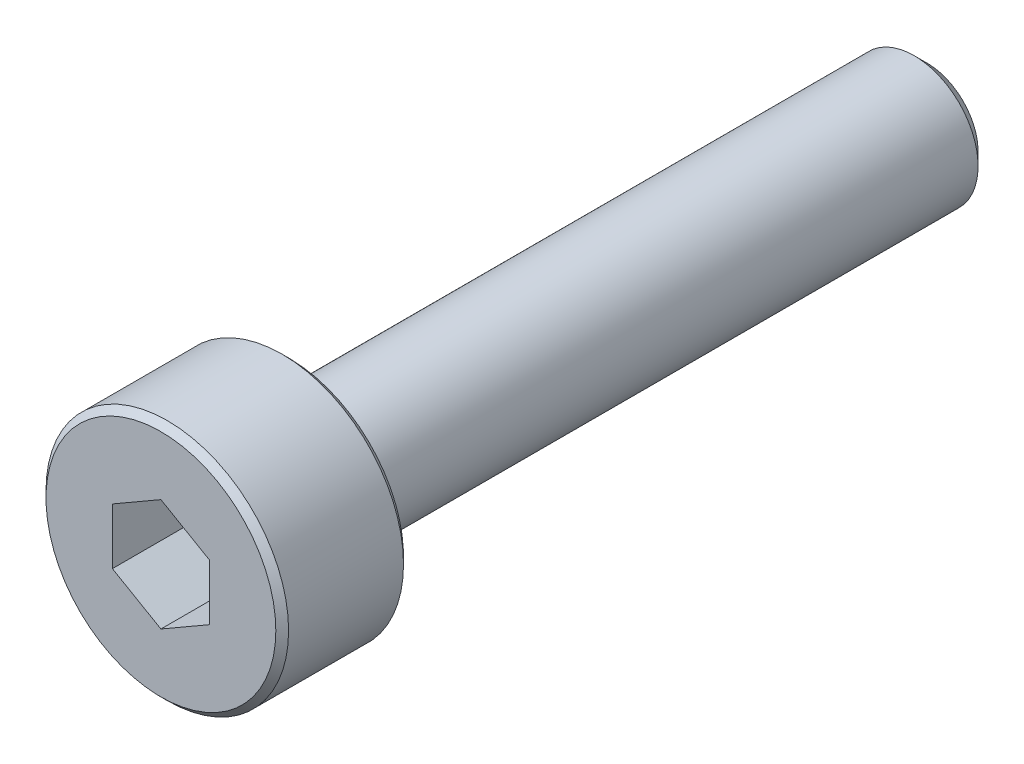
ISO-10303-21;
HEADER;
FILE_DESCRIPTION(('STEP AP214'),'2;1');
FILE_NAME('part.step','',(''),(''),'','','');
FILE_SCHEMA(('AUTOMOTIVE_DESIGN { 1 0 10303 214 1 1 1 1 }'));
ENDSEC;
DATA;
#1=APPLICATION_CONTEXT('core data for automotive mechanical design processes');
#2=APPLICATION_PROTOCOL_DEFINITION('international standard','automotive_design',2000,#1);
#3=PRODUCT_CONTEXT('',#1,'mechanical');
#4=PRODUCT('Part','Part','',(#3));
#5=PRODUCT_RELATED_PRODUCT_CATEGORY('part','',(#4));
#6=PRODUCT_DEFINITION_FORMATION('','',#4);
#7=PRODUCT_DEFINITION_CONTEXT('part definition',#1,'design');
#8=PRODUCT_DEFINITION('design','',#6,#7);
#9=PRODUCT_DEFINITION_SHAPE('','',#8);
#10=(LENGTH_UNIT() NAMED_UNIT(*) SI_UNIT(.MILLI.,.METRE.));
#11=(NAMED_UNIT(*) PLANE_ANGLE_UNIT() SI_UNIT($,.RADIAN.));
#12=(NAMED_UNIT(*) SI_UNIT($,.STERADIAN.) SOLID_ANGLE_UNIT());
#13=UNCERTAINTY_MEASURE_WITH_UNIT(LENGTH_MEASURE(1.E-05),#10,'distance_accuracy_value','');
#14=(GEOMETRIC_REPRESENTATION_CONTEXT(3) GLOBAL_UNCERTAINTY_ASSIGNED_CONTEXT((#13)) GLOBAL_UNIT_ASSIGNED_CONTEXT((#10,
#11,#12)) REPRESENTATION_CONTEXT('',''));
#15=CARTESIAN_POINT('',(0.,0.,0.));
#16=DIRECTION('',(0.,0.,1.));
#17=DIRECTION('',(1.,0.,0.));
#18=AXIS2_PLACEMENT_3D('',#15,#16,#17);
#19=CARTESIAN_POINT('',(0.,0.,10.));
#20=DIRECTION('',(0.,0.,1.));
#21=DIRECTION('',(1.,0.,0.));
#22=AXIS2_PLACEMENT_3D('',#19,#20,#21);
#23=CYLINDRICAL_SURFACE('',#22,1.9);
#24=CARTESIAN_POINT('',(0.,0.,10.1000007633703));
#25=DIRECTION('',(0.,0.,-1.));
#26=DIRECTION('',(-1.,0.,0.));
#27=AXIS2_PLACEMENT_3D('',#24,#25,#26);
#28=CIRCLE('',#27,1.9);
#29=CARTESIAN_POINT('',(-1.9,0.,10.1000007633703));
#30=VERTEX_POINT('',#29);
#31=EDGE_CURVE('E153',#30,#30,#28,.F.);
#32=ORIENTED_EDGE('',*,*,#31,.T.);
#33=EDGE_LOOP('',(#32));
#34=FACE_BOUND('',#33,.T.);
#35=CARTESIAN_POINT('',(0.,0.,11.8999991776262));
#36=DIRECTION('',(0.,0.,1.));
#37=DIRECTION('',(1.,0.,0.));
#38=AXIS2_PLACEMENT_3D('',#35,#36,#37);
#39=CIRCLE('',#38,1.9);
#40=CARTESIAN_POINT('',(1.9,0.,11.8999991776262));
#41=VERTEX_POINT('',#40);
#42=EDGE_CURVE('E150',#41,#41,#39,.F.);
#43=ORIENTED_EDGE('',*,*,#42,.T.);
#44=EDGE_LOOP('',(#43));
#45=FACE_BOUND('',#44,.T.);
#46=ADVANCED_FACE('F39',(#34,#45),#23,.T.);
#47=CARTESIAN_POINT('',(1.9,0.,10.));
#48=DIRECTION('',(0.,0.,-1.));
#49=DIRECTION('',(-1.,0.,0.));
#50=AXIS2_PLACEMENT_3D('',#47,#48,#49);
#51=PLANE('',#50);
#52=CARTESIAN_POINT('',(0.,0.,10.));
#53=DIRECTION('',(0.,0.,-1.));
#54=DIRECTION('',(-1.,0.,0.));
#55=AXIS2_PLACEMENT_3D('',#52,#53,#54);
#56=CIRCLE('',#55,1.79999917762621);
#57=CARTESIAN_POINT('',(-1.79999917762621,0.,10.));
#58=VERTEX_POINT('',#57);
#59=EDGE_CURVE('E156',#58,#58,#56,.T.);
#60=ORIENTED_EDGE('',*,*,#59,.T.);
#61=EDGE_LOOP('',(#60));
#62=FACE_BOUND('',#61,.T.);
#63=CARTESIAN_POINT('',(0.,0.,10.));
#64=DIRECTION('',(0.,0.,-1.));
#65=DIRECTION('',(-1.,0.,0.));
#66=AXIS2_PLACEMENT_3D('',#63,#64,#65);
#67=CIRCLE('',#66,1.);
#68=CARTESIAN_POINT('',(-1.,0.,10.));
#69=VERTEX_POINT('',#68);
#70=EDGE_CURVE('E142',#69,#69,#67,.T.);
#71=ORIENTED_EDGE('',*,*,#70,.F.);
#72=EDGE_LOOP('',(#71));
#73=FACE_BOUND('',#72,.T.);
#74=ADVANCED_FACE('F176',(#62,#73),#51,.T.);
#75=CARTESIAN_POINT('',(0.,0.,12.));
#76=DIRECTION('',(0.,0.,1.));
#77=DIRECTION('',(1.,0.,0.));
#78=AXIS2_PLACEMENT_3D('',#75,#76,#77);
#79=PLANE('',#78);
#80=CARTESIAN_POINT('',(0.,0.,12.));
#81=DIRECTION('',(0.,0.,1.));
#82=DIRECTION('',(1.,0.,0.));
#83=AXIS2_PLACEMENT_3D('',#80,#81,#82);
#84=CIRCLE('',#83,1.79999923662968);
#85=CARTESIAN_POINT('',(1.79999923662968,0.,12.));
#86=VERTEX_POINT('',#85);
#87=EDGE_CURVE('E159',#86,#86,#84,.T.);
#88=ORIENTED_EDGE('',*,*,#87,.T.);
#89=EDGE_LOOP('',(#88));
#90=FACE_BOUND('',#89,.T.);
#91=DIRECTION('',(0.,-1.,0.));
#92=VECTOR('',#91,1.);
#93=CARTESIAN_POINT('',(-0.759999999999996,0.438786204584093,12.));
#94=LINE('',#93,#92);
#95=CARTESIAN_POINT('',(-0.759999999999996,0.438786204584093,12.));
#96=VERTEX_POINT('',#95);
#97=CARTESIAN_POINT('',(-0.76,-0.4387862045841,12.));
#98=VERTEX_POINT('',#97);
#99=EDGE_CURVE('E55',#96,#98,#94,.T.);
#100=ORIENTED_EDGE('',*,*,#99,.F.);
#101=DIRECTION('',(-0.866025403784438,-0.500000000000002,0.));
#102=VECTOR('',#101,1.);
#103=CARTESIAN_POINT('',(0.,0.877572409168213,12.));
#104=LINE('',#103,#102);
#105=CARTESIAN_POINT('',(0.,0.877572409168213,12.));
#106=VERTEX_POINT('',#105);
#107=EDGE_CURVE('E138',#106,#96,#104,.T.);
#108=ORIENTED_EDGE('',*,*,#107,.F.);
#109=DIRECTION('',(-0.866025403784438,0.500000000000002,0.));
#110=VECTOR('',#109,1.);
#111=CARTESIAN_POINT('',(0.76,0.4387862045841,12.));
#112=LINE('',#111,#110);
#113=CARTESIAN_POINT('',(0.76,0.4387862045841,12.));
#114=VERTEX_POINT('',#113);
#115=EDGE_CURVE('E136',#114,#106,#112,.T.);
#116=ORIENTED_EDGE('',*,*,#115,.F.);
#117=DIRECTION('',(0.,1.,0.));
#118=VECTOR('',#117,1.);
#119=CARTESIAN_POINT('',(0.759999999999996,-0.438786204584093,12.));
#120=LINE('',#119,#118);
#121=CARTESIAN_POINT('',(0.759999999999996,-0.438786204584093,12.));
#122=VERTEX_POINT('',#121);
#123=EDGE_CURVE('E103',#122,#114,#120,.T.);
#124=ORIENTED_EDGE('',*,*,#123,.F.);
#125=DIRECTION('',(0.86602540378444,0.499999999999998,0.));
#126=VECTOR('',#125,1.);
#127=CARTESIAN_POINT('',(0.,-0.877572409168207,12.));
#128=LINE('',#127,#126);
#129=CARTESIAN_POINT('',(0.,-0.877572409168207,12.));
#130=VERTEX_POINT('',#129);
#131=EDGE_CURVE('E132',#130,#122,#128,.T.);
#132=ORIENTED_EDGE('',*,*,#131,.F.);
#133=DIRECTION('',(0.866025403784442,-0.499999999999994,0.));
#134=VECTOR('',#133,1.);
#135=CARTESIAN_POINT('',(-0.76,-0.4387862045841,12.));
#136=LINE('',#135,#134);
#137=EDGE_CURVE('E129',#98,#130,#136,.T.);
#138=ORIENTED_EDGE('',*,*,#137,.F.);
#139=EDGE_LOOP('',(#100,#108,#116,#124,#132,#138));
#140=FACE_BOUND('',#139,.T.);
#141=ADVANCED_FACE('F182',(#90,#140),#79,.T.);
#142=CARTESIAN_POINT('',(0.,0.,0.));
#143=DIRECTION('',(0.,0.,1.));
#144=DIRECTION('',(1.,0.,0.));
#145=AXIS2_PLACEMENT_3D('',#142,#143,#144);
#146=CYLINDRICAL_SURFACE('',#145,1.);
#147=CARTESIAN_POINT('',(0.,0.,0.200010455459759));
#148=DIRECTION('',(0.,0.,-1.));
#149=DIRECTION('',(-1.,0.,0.));
#150=AXIS2_PLACEMENT_3D('',#147,#148,#149);
#151=CIRCLE('',#150,1.);
#152=CARTESIAN_POINT('',(-1.,0.,0.200010455459759));
#153=VERTEX_POINT('',#152);
#154=EDGE_CURVE('E11',#153,#153,#151,.F.);
#155=ORIENTED_EDGE('',*,*,#154,.T.);
#156=EDGE_LOOP('',(#155));
#157=FACE_BOUND('',#156,.T.);
#158=ORIENTED_EDGE('',*,*,#70,.T.);
#159=EDGE_LOOP('',(#158));
#160=FACE_BOUND('',#159,.T.);
#161=ADVANCED_FACE('F209',(#157,#160),#146,.T.);
#162=CARTESIAN_POINT('',(0.,0.,0.));
#163=DIRECTION('',(0.,0.,-1.));
#164=DIRECTION('',(-1.,0.,0.));
#165=AXIS2_PLACEMENT_3D('',#162,#163,#164);
#166=PLANE('',#165);
#167=CARTESIAN_POINT('',(0.,0.,0.));
#168=DIRECTION('',(0.,0.,-1.));
#169=DIRECTION('',(-1.,0.,0.));
#170=AXIS2_PLACEMENT_3D('',#167,#168,#169);
#171=CIRCLE('',#170,0.799991635727209);
#172=CARTESIAN_POINT('',(-0.799991635727209,0.,0.));
#173=VERTEX_POINT('',#172);
#174=EDGE_CURVE('E48',#173,#173,#171,.T.);
#175=ORIENTED_EDGE('',*,*,#174,.T.);
#176=EDGE_LOOP('',(#175));
#177=FACE_BOUND('',#176,.T.);
#178=ADVANCED_FACE('F164',(#177),#166,.T.);
#179=CARTESIAN_POINT('',(-0.759999999999996,0.438786204584093,10.5));
#180=DIRECTION('',(-1.,0.,0.));
#181=DIRECTION('',(0.,-1.,0.));
#182=AXIS2_PLACEMENT_3D('',#179,#180,#181);
#183=PLANE('',#182);
#184=ORIENTED_EDGE('',*,*,#99,.T.);
#185=DIRECTION('',(0.,0.,1.));
#186=VECTOR('',#185,1.);
#187=CARTESIAN_POINT('',(-0.76,-0.4387862045841,10.5));
#188=LINE('',#187,#186);
#189=CARTESIAN_POINT('',(-0.76,-0.4387862045841,10.5));
#190=VERTEX_POINT('',#189);
#191=EDGE_CURVE('E85',#190,#98,#188,.T.);
#192=ORIENTED_EDGE('',*,*,#191,.F.);
#193=DIRECTION('',(0.,-1.,0.));
#194=VECTOR('',#193,1.);
#195=CARTESIAN_POINT('',(-0.759999999999996,0.438786204584093,10.5));
#196=LINE('',#195,#194);
#197=CARTESIAN_POINT('',(-0.759999999999996,0.438786204584093,10.5));
#198=VERTEX_POINT('',#197);
#199=EDGE_CURVE('E140',#198,#190,#196,.T.);
#200=ORIENTED_EDGE('',*,*,#199,.F.);
#201=DIRECTION('',(0.,0.,1.));
#202=VECTOR('',#201,1.);
#203=CARTESIAN_POINT('',(-0.759999999999996,0.438786204584093,10.5));
#204=LINE('',#203,#202);
#205=EDGE_CURVE('E63',#198,#96,#204,.T.);
#206=ORIENTED_EDGE('',*,*,#205,.T.);
#207=EDGE_LOOP('',(#184,#192,#200,#206));
#208=FACE_BOUND('',#207,.T.);
#209=ADVANCED_FACE('F217',(#208),#183,.F.);
#210=CARTESIAN_POINT('',(0.,0.877572409168213,10.5));
#211=DIRECTION('',(-0.500000000000002,0.866025403784438,0.));
#212=DIRECTION('',(-0.866025403784438,-0.500000000000002,0.));
#213=AXIS2_PLACEMENT_3D('',#210,#211,#212);
#214=PLANE('',#213);
#215=ORIENTED_EDGE('',*,*,#107,.T.);
#216=ORIENTED_EDGE('',*,*,#205,.F.);
#217=DIRECTION('',(-0.866025403784438,-0.500000000000002,0.));
#218=VECTOR('',#217,1.);
#219=CARTESIAN_POINT('',(0.,0.877572409168213,10.5));
#220=LINE('',#219,#218);
#221=CARTESIAN_POINT('',(0.,0.877572409168213,10.5));
#222=VERTEX_POINT('',#221);
#223=EDGE_CURVE('E115',#222,#198,#220,.T.);
#224=ORIENTED_EDGE('',*,*,#223,.F.);
#225=DIRECTION('',(0.,0.,1.));
#226=VECTOR('',#225,1.);
#227=CARTESIAN_POINT('',(0.,0.877572409168213,10.5));
#228=LINE('',#227,#226);
#229=EDGE_CURVE('E107',#222,#106,#228,.T.);
#230=ORIENTED_EDGE('',*,*,#229,.T.);
#231=EDGE_LOOP('',(#215,#216,#224,#230));
#232=FACE_BOUND('',#231,.T.);
#233=ADVANCED_FACE('F223',(#232),#214,.F.);
#234=CARTESIAN_POINT('',(0.76,0.4387862045841,10.5));
#235=DIRECTION('',(0.500000000000002,0.866025403784438,0.));
#236=DIRECTION('',(-0.866025403784438,0.500000000000002,0.));
#237=AXIS2_PLACEMENT_3D('',#234,#235,#236);
#238=PLANE('',#237);
#239=ORIENTED_EDGE('',*,*,#115,.T.);
#240=ORIENTED_EDGE('',*,*,#229,.F.);
#241=DIRECTION('',(-0.866025403784438,0.500000000000002,0.));
#242=VECTOR('',#241,1.);
#243=CARTESIAN_POINT('',(0.76,0.4387862045841,10.5));
#244=LINE('',#243,#242);
#245=CARTESIAN_POINT('',(0.76,0.4387862045841,10.5));
#246=VERTEX_POINT('',#245);
#247=EDGE_CURVE('E111',#246,#222,#244,.T.);
#248=ORIENTED_EDGE('',*,*,#247,.F.);
#249=DIRECTION('',(0.,0.,1.));
#250=VECTOR('',#249,1.);
#251=CARTESIAN_POINT('',(0.76,0.4387862045841,10.5));
#252=LINE('',#251,#250);
#253=EDGE_CURVE('E96',#246,#114,#252,.T.);
#254=ORIENTED_EDGE('',*,*,#253,.T.);
#255=EDGE_LOOP('',(#239,#240,#248,#254));
#256=FACE_BOUND('',#255,.T.);
#257=ADVANCED_FACE('F112',(#256),#238,.F.);
#258=CARTESIAN_POINT('',(0.759999999999996,-0.438786204584093,10.5));
#259=DIRECTION('',(1.,0.,0.));
#260=DIRECTION('',(0.,1.,0.));
#261=AXIS2_PLACEMENT_3D('',#258,#259,#260);
#262=PLANE('',#261);
#263=ORIENTED_EDGE('',*,*,#123,.T.);
#264=ORIENTED_EDGE('',*,*,#253,.F.);
#265=DIRECTION('',(0.,1.,0.));
#266=VECTOR('',#265,1.);
#267=CARTESIAN_POINT('',(0.759999999999996,-0.438786204584093,10.5));
#268=LINE('',#267,#266);
#269=CARTESIAN_POINT('',(0.759999999999996,-0.438786204584093,10.5));
#270=VERTEX_POINT('',#269);
#271=EDGE_CURVE('E100',#270,#246,#268,.T.);
#272=ORIENTED_EDGE('',*,*,#271,.F.);
#273=DIRECTION('',(0.,0.,1.));
#274=VECTOR('',#273,1.);
#275=CARTESIAN_POINT('',(0.759999999999996,-0.438786204584093,10.5));
#276=LINE('',#275,#274);
#277=EDGE_CURVE('E108',#270,#122,#276,.T.);
#278=ORIENTED_EDGE('',*,*,#277,.T.);
#279=EDGE_LOOP('',(#263,#264,#272,#278));
#280=FACE_BOUND('',#279,.T.);
#281=ADVANCED_FACE('F98',(#280),#262,.F.);
#282=CARTESIAN_POINT('',(0.,-0.877572409168207,10.5));
#283=DIRECTION('',(0.499999999999998,-0.86602540378444,0.));
#284=DIRECTION('',(0.86602540378444,0.499999999999998,0.));
#285=AXIS2_PLACEMENT_3D('',#282,#283,#284);
#286=PLANE('',#285);
#287=ORIENTED_EDGE('',*,*,#131,.T.);
#288=ORIENTED_EDGE('',*,*,#277,.F.);
#289=DIRECTION('',(0.86602540378444,0.499999999999998,0.));
#290=VECTOR('',#289,1.);
#291=CARTESIAN_POINT('',(0.,-0.877572409168207,10.5));
#292=LINE('',#291,#290);
#293=CARTESIAN_POINT('',(0.,-0.877572409168207,10.5));
#294=VERTEX_POINT('',#293);
#295=EDGE_CURVE('E121',#294,#270,#292,.T.);
#296=ORIENTED_EDGE('',*,*,#295,.F.);
#297=DIRECTION('',(0.,0.,1.));
#298=VECTOR('',#297,1.);
#299=CARTESIAN_POINT('',(0.,-0.877572409168207,10.5));
#300=LINE('',#299,#298);
#301=EDGE_CURVE('E145',#294,#130,#300,.T.);
#302=ORIENTED_EDGE('',*,*,#301,.T.);
#303=EDGE_LOOP('',(#287,#288,#296,#302));
#304=FACE_BOUND('',#303,.T.);
#305=ADVANCED_FACE('F226',(#304),#286,.F.);
#306=CARTESIAN_POINT('',(-0.76,-0.4387862045841,10.5));
#307=DIRECTION('',(-0.499999999999994,-0.866025403784442,0.));
#308=DIRECTION('',(0.866025403784442,-0.499999999999994,0.));
#309=AXIS2_PLACEMENT_3D('',#306,#307,#308);
#310=PLANE('',#309);
#311=ORIENTED_EDGE('',*,*,#137,.T.);
#312=ORIENTED_EDGE('',*,*,#301,.F.);
#313=DIRECTION('',(0.866025403784442,-0.499999999999994,0.));
#314=VECTOR('',#313,1.);
#315=CARTESIAN_POINT('',(-0.76,-0.4387862045841,10.5));
#316=LINE('',#315,#314);
#317=EDGE_CURVE('E123',#190,#294,#316,.T.);
#318=ORIENTED_EDGE('',*,*,#317,.F.);
#319=ORIENTED_EDGE('',*,*,#191,.T.);
#320=EDGE_LOOP('',(#311,#312,#318,#319));
#321=FACE_BOUND('',#320,.T.);
#322=ADVANCED_FACE('F201',(#321),#310,.F.);
#323=CARTESIAN_POINT('',(0.,0.,10.5));
#324=DIRECTION('',(0.,0.,1.));
#325=DIRECTION('',(1.,0.,0.));
#326=AXIS2_PLACEMENT_3D('',#323,#324,#325);
#327=PLANE('',#326);
#328=ORIENTED_EDGE('',*,*,#199,.T.);
#329=ORIENTED_EDGE('',*,*,#317,.T.);
#330=ORIENTED_EDGE('',*,*,#295,.T.);
#331=ORIENTED_EDGE('',*,*,#271,.T.);
#332=ORIENTED_EDGE('',*,*,#247,.T.);
#333=ORIENTED_EDGE('',*,*,#223,.T.);
#334=EDGE_LOOP('',(#328,#329,#330,#331,#332,#333));
#335=FACE_BOUND('',#334,.T.);
#336=ADVANCED_FACE('F118',(#335),#327,.T.);
#337=CARTESIAN_POINT('',(0.,0.,10.1000007633703));
#338=DIRECTION('',(0.,0.,1.));
#339=DIRECTION('',(1.,0.,0.));
#340=AXIS2_PLACEMENT_3D('',#337,#338,#339);
#341=CONICAL_SURFACE('',#340,1.9,0.78539845841245);
#342=ORIENTED_EDGE('',*,*,#59,.F.);
#343=EDGE_LOOP('',(#342));
#344=FACE_BOUND('',#343,.T.);
#345=ORIENTED_EDGE('',*,*,#31,.F.);
#346=EDGE_LOOP('',(#345));
#347=FACE_BOUND('',#346,.T.);
#348=ADVANCED_FACE('F172',(#344,#347),#341,.T.);
#349=CARTESIAN_POINT('',(0.,0.,12.));
#350=DIRECTION('',(0.,0.,-1.));
#351=DIRECTION('',(-1.,0.,0.));
#352=AXIS2_PLACEMENT_3D('',#349,#350,#351);
#353=CONICAL_SURFACE('',#352,1.79999923662968,0.78539786838244);
#354=ORIENTED_EDGE('',*,*,#42,.F.);
#355=EDGE_LOOP('',(#354));
#356=FACE_BOUND('',#355,.T.);
#357=ORIENTED_EDGE('',*,*,#87,.F.);
#358=EDGE_LOOP('',(#357));
#359=FACE_BOUND('',#358,.T.);
#360=ADVANCED_FACE('F167',(#356,#359),#353,.T.);
#361=CARTESIAN_POINT('',(0.,0.,0.));
#362=DIRECTION('',(0.,0.,1.));
#363=DIRECTION('',(1.,0.,0.));
#364=AXIS2_PLACEMENT_3D('',#361,#362,#363);
#365=CONICAL_SURFACE('',#364,0.799991635727209,0.78539293567599);
#366=ORIENTED_EDGE('',*,*,#154,.F.);
#367=EDGE_LOOP('',(#366));
#368=FACE_BOUND('',#367,.T.);
#369=ORIENTED_EDGE('',*,*,#174,.F.);
#370=EDGE_LOOP('',(#369));
#371=FACE_BOUND('',#370,.T.);
#372=ADVANCED_FACE('F42',(#368,#371),#365,.T.);
#373=CLOSED_SHELL('',(#46,#74,#141,#161,#178,#209,#233,#257,#281,#305,#322,#336,#348,#360,#372));
#374=MANIFOLD_SOLID_BREP('B2',#373);
#375=ADVANCED_BREP_SHAPE_REPRESENTATION('',(#18,#374),#14);
#376=SHAPE_DEFINITION_REPRESENTATION(#9,#375);
ENDSEC;
END-ISO-10303-21;
